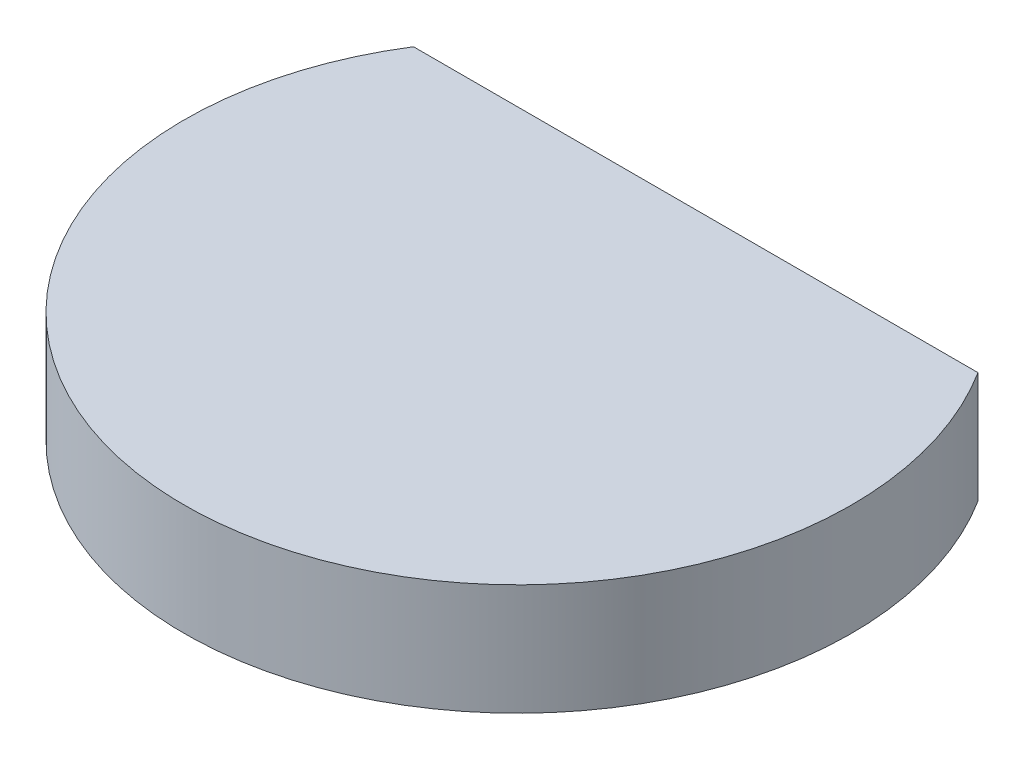
ISO-10303-21;
HEADER;
FILE_DESCRIPTION(('STEP AP214'),'2;1');
FILE_NAME('part.step','',(''),(''),'','','');
FILE_SCHEMA(('AUTOMOTIVE_DESIGN { 1 0 10303 214 1 1 1 1 }'));
ENDSEC;
DATA;
#1=APPLICATION_CONTEXT('core data for automotive mechanical design processes');
#2=APPLICATION_PROTOCOL_DEFINITION('international standard','automotive_design',2000,#1);
#3=PRODUCT_CONTEXT('',#1,'mechanical');
#4=PRODUCT('Part','Part','',(#3));
#5=PRODUCT_RELATED_PRODUCT_CATEGORY('part','',(#4));
#6=PRODUCT_DEFINITION_FORMATION('','',#4);
#7=PRODUCT_DEFINITION_CONTEXT('part definition',#1,'design');
#8=PRODUCT_DEFINITION('design','',#6,#7);
#9=PRODUCT_DEFINITION_SHAPE('','',#8);
#10=(LENGTH_UNIT() NAMED_UNIT(*) SI_UNIT(.MILLI.,.METRE.));
#11=(NAMED_UNIT(*) PLANE_ANGLE_UNIT() SI_UNIT($,.RADIAN.));
#12=(NAMED_UNIT(*) SI_UNIT($,.STERADIAN.) SOLID_ANGLE_UNIT());
#13=UNCERTAINTY_MEASURE_WITH_UNIT(LENGTH_MEASURE(1.E-05),#10,'distance_accuracy_value','');
#14=(GEOMETRIC_REPRESENTATION_CONTEXT(3) GLOBAL_UNCERTAINTY_ASSIGNED_CONTEXT((#13)) GLOBAL_UNIT_ASSIGNED_CONTEXT((#10,
#11,#12)) REPRESENTATION_CONTEXT('',''));
#15=CARTESIAN_POINT('',(0.,0.,0.));
#16=DIRECTION('',(0.,0.,1.));
#17=DIRECTION('',(1.,0.,0.));
#18=AXIS2_PLACEMENT_3D('',#15,#16,#17);
#19=CARTESIAN_POINT('',(0.,0.1,0.));
#20=DIRECTION('',(0.,-1.,0.));
#21=DIRECTION('',(0.,0.,-1.));
#22=AXIS2_PLACEMENT_3D('',#19,#20,#21);
#23=CYLINDRICAL_SURFACE('',#22,0.3);
#24=CARTESIAN_POINT('',(0.,0.,0.));
#25=DIRECTION('',(0.,1.,0.));
#26=DIRECTION('',(0.,0.,1.));
#27=AXIS2_PLACEMENT_3D('',#24,#25,#26);
#28=CIRCLE('',#27,0.3);
#29=CARTESIAN_POINT('',(-0.25377155080899,0.,-0.16));
#30=VERTEX_POINT('',#29);
#31=CARTESIAN_POINT('',(0.25377155080899,0.,-0.16));
#32=VERTEX_POINT('',#31);
#33=EDGE_CURVE('E66',#30,#32,#28,.T.);
#34=ORIENTED_EDGE('',*,*,#33,.T.);
#35=DIRECTION('',(0.,-1.,0.));
#36=VECTOR('',#35,1.);
#37=CARTESIAN_POINT('',(0.25377155080899,0.1,-0.16));
#38=LINE('',#37,#36);
#39=CARTESIAN_POINT('',(0.25377155080899,0.1,-0.16));
#40=VERTEX_POINT('',#39);
#41=EDGE_CURVE('E11',#40,#32,#38,.T.);
#42=ORIENTED_EDGE('',*,*,#41,.F.);
#43=CARTESIAN_POINT('',(0.,0.1,0.));
#44=DIRECTION('',(0.,1.,0.));
#45=DIRECTION('',(0.,0.,1.));
#46=AXIS2_PLACEMENT_3D('',#43,#44,#45);
#47=CIRCLE('',#46,0.3);
#48=CARTESIAN_POINT('',(-0.25377155080899,0.1,-0.16));
#49=VERTEX_POINT('',#48);
#50=EDGE_CURVE('E65',#49,#40,#47,.T.);
#51=ORIENTED_EDGE('',*,*,#50,.F.);
#52=DIRECTION('',(0.,-1.,0.));
#53=VECTOR('',#52,1.);
#54=CARTESIAN_POINT('',(-0.25377155080899,0.1,-0.16));
#55=LINE('',#54,#53);
#56=EDGE_CURVE('E43',#49,#30,#55,.T.);
#57=ORIENTED_EDGE('',*,*,#56,.T.);
#58=EDGE_LOOP('',(#34,#42,#51,#57));
#59=FACE_BOUND('',#58,.T.);
#60=ADVANCED_FACE('F35',(#59),#23,.T.);
#61=CARTESIAN_POINT('',(-0.25377155080899,0.1,-0.16));
#62=DIRECTION('',(0.,0.,1.));
#63=DIRECTION('',(1.,0.,0.));
#64=AXIS2_PLACEMENT_3D('',#61,#62,#63);
#65=PLANE('',#64);
#66=DIRECTION('',(-1.,0.,0.));
#67=VECTOR('',#66,1.);
#68=CARTESIAN_POINT('',(-0.25377155080899,0.,-0.16));
#69=LINE('',#68,#67);
#70=EDGE_CURVE('E58',#32,#30,#69,.T.);
#71=ORIENTED_EDGE('',*,*,#70,.T.);
#72=ORIENTED_EDGE('',*,*,#56,.F.);
#73=DIRECTION('',(-1.,0.,0.));
#74=VECTOR('',#73,1.);
#75=CARTESIAN_POINT('',(-0.25377155080899,0.1,-0.16));
#76=LINE('',#75,#74);
#77=EDGE_CURVE('E50',#40,#49,#76,.T.);
#78=ORIENTED_EDGE('',*,*,#77,.F.);
#79=ORIENTED_EDGE('',*,*,#41,.T.);
#80=EDGE_LOOP('',(#71,#72,#78,#79));
#81=FACE_BOUND('',#80,.T.);
#82=ADVANCED_FACE('F61',(#81),#65,.F.);
#83=CARTESIAN_POINT('',(0.,0.1,0.));
#84=DIRECTION('',(0.,1.,0.));
#85=DIRECTION('',(0.,0.,1.));
#86=AXIS2_PLACEMENT_3D('',#83,#84,#85);
#87=PLANE('',#86);
#88=ORIENTED_EDGE('',*,*,#50,.T.);
#89=ORIENTED_EDGE('',*,*,#77,.T.);
#90=EDGE_LOOP('',(#88,#89));
#91=FACE_BOUND('',#90,.T.);
#92=ADVANCED_FACE('F73',(#91),#87,.T.);
#93=CARTESIAN_POINT('',(0.,0.,0.));
#94=DIRECTION('',(0.,1.,0.));
#95=DIRECTION('',(0.,0.,1.));
#96=AXIS2_PLACEMENT_3D('',#93,#94,#95);
#97=PLANE('',#96);
#98=ORIENTED_EDGE('',*,*,#33,.F.);
#99=ORIENTED_EDGE('',*,*,#70,.F.);
#100=EDGE_LOOP('',(#98,#99));
#101=FACE_BOUND('',#100,.T.);
#102=ADVANCED_FACE('F69',(#101),#97,.F.);
#103=CLOSED_SHELL('',(#60,#82,#92,#102));
#104=MANIFOLD_SOLID_BREP('B2',#103);
#105=ADVANCED_BREP_SHAPE_REPRESENTATION('',(#18,#104),#14);
#106=SHAPE_DEFINITION_REPRESENTATION(#9,#105);
ENDSEC;
END-ISO-10303-21;
